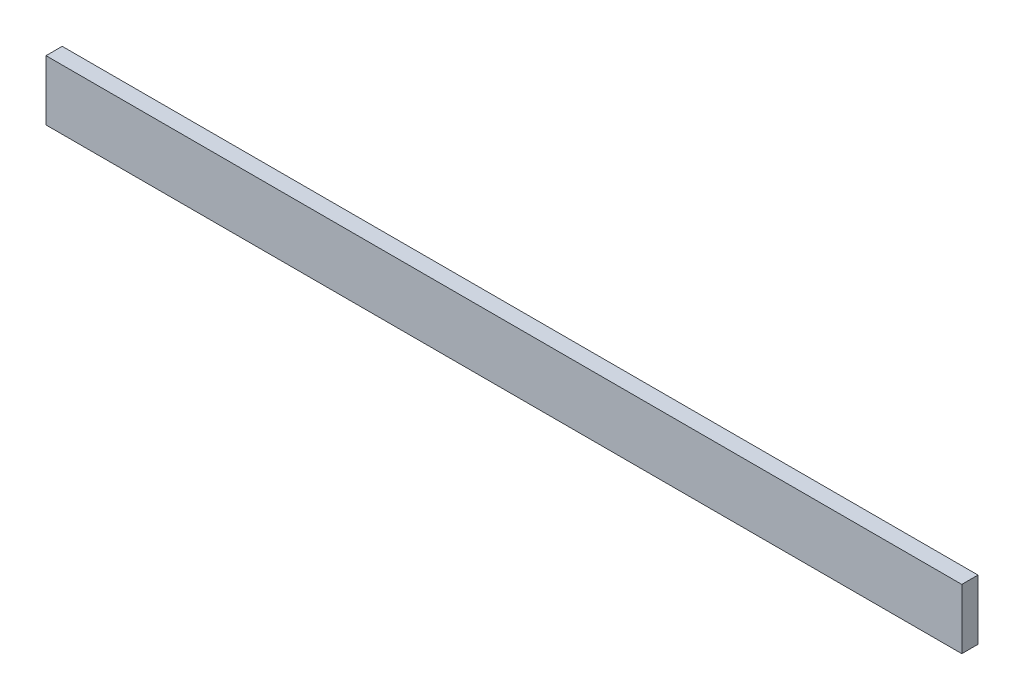
ISO-10303-21;
HEADER;
FILE_DESCRIPTION(('STEP AP214'),'2;1');
FILE_NAME('part.step','',(''),(''),'','','');
FILE_SCHEMA(('AUTOMOTIVE_DESIGN { 1 0 10303 214 1 1 1 1 }'));
ENDSEC;
DATA;
#1=APPLICATION_CONTEXT('core data for automotive mechanical design processes');
#2=APPLICATION_PROTOCOL_DEFINITION('international standard','automotive_design',2000,#1);
#3=PRODUCT_CONTEXT('',#1,'mechanical');
#4=PRODUCT('Part','Part','',(#3));
#5=PRODUCT_RELATED_PRODUCT_CATEGORY('part','',(#4));
#6=PRODUCT_DEFINITION_FORMATION('','',#4);
#7=PRODUCT_DEFINITION_CONTEXT('part definition',#1,'design');
#8=PRODUCT_DEFINITION('design','',#6,#7);
#9=PRODUCT_DEFINITION_SHAPE('','',#8);
#10=(LENGTH_UNIT() NAMED_UNIT(*) SI_UNIT(.MILLI.,.METRE.));
#11=(NAMED_UNIT(*) PLANE_ANGLE_UNIT() SI_UNIT($,.RADIAN.));
#12=(NAMED_UNIT(*) SI_UNIT($,.STERADIAN.) SOLID_ANGLE_UNIT());
#13=UNCERTAINTY_MEASURE_WITH_UNIT(LENGTH_MEASURE(1.E-05),#10,'distance_accuracy_value','');
#14=(GEOMETRIC_REPRESENTATION_CONTEXT(3) GLOBAL_UNCERTAINTY_ASSIGNED_CONTEXT((#13)) GLOBAL_UNIT_ASSIGNED_CONTEXT((#10,
#11,#12)) REPRESENTATION_CONTEXT('',''));
#15=CARTESIAN_POINT('',(0.,0.,0.));
#16=DIRECTION('',(0.,0.,1.));
#17=DIRECTION('',(1.,0.,0.));
#18=AXIS2_PLACEMENT_3D('',#15,#16,#17);
#19=CARTESIAN_POINT('',(0.,0.,27.));
#20=DIRECTION('',(1.,0.,0.));
#21=DIRECTION('',(0.,0.,-1.));
#22=AXIS2_PLACEMENT_3D('',#19,#20,#21);
#23=PLANE('',#22);
#24=DIRECTION('',(0.,-1.,0.));
#25=VECTOR('',#24,1.);
#26=CARTESIAN_POINT('',(0.,0.,0.));
#27=LINE('',#26,#25);
#28=CARTESIAN_POINT('',(0.,100.,0.));
#29=VERTEX_POINT('',#28);
#30=CARTESIAN_POINT('',(0.,0.,0.));
#31=VERTEX_POINT('',#30);
#32=EDGE_CURVE('E96',#29,#31,#27,.T.);
#33=ORIENTED_EDGE('',*,*,#32,.T.);
#34=DIRECTION('',(0.,0.,-1.));
#35=VECTOR('',#34,1.);
#36=CARTESIAN_POINT('',(0.,0.,27.));
#37=LINE('',#36,#35);
#38=CARTESIAN_POINT('',(0.,0.,27.));
#39=VERTEX_POINT('',#38);
#40=EDGE_CURVE('E11',#39,#31,#37,.T.);
#41=ORIENTED_EDGE('',*,*,#40,.F.);
#42=DIRECTION('',(0.,-1.,0.));
#43=VECTOR('',#42,1.);
#44=CARTESIAN_POINT('',(0.,0.,27.));
#45=LINE('',#44,#43);
#46=CARTESIAN_POINT('',(0.,100.,27.));
#47=VERTEX_POINT('',#46);
#48=EDGE_CURVE('E84',#47,#39,#45,.T.);
#49=ORIENTED_EDGE('',*,*,#48,.F.);
#50=DIRECTION('',(0.,0.,-1.));
#51=VECTOR('',#50,1.);
#52=CARTESIAN_POINT('',(0.,100.,27.));
#53=LINE('',#52,#51);
#54=EDGE_CURVE('E92',#47,#29,#53,.T.);
#55=ORIENTED_EDGE('',*,*,#54,.T.);
#56=EDGE_LOOP('',(#33,#41,#49,#55));
#57=FACE_BOUND('',#56,.T.);
#58=ADVANCED_FACE('F33',(#57),#23,.F.);
#59=CARTESIAN_POINT('',(0.,0.,27.));
#60=DIRECTION('',(0.,1.,0.));
#61=DIRECTION('',(0.,0.,1.));
#62=AXIS2_PLACEMENT_3D('',#59,#60,#61);
#63=PLANE('',#62);
#64=DIRECTION('',(1.,0.,0.));
#65=VECTOR('',#64,1.);
#66=CARTESIAN_POINT('',(0.,0.,0.));
#67=LINE('',#66,#65);
#68=CARTESIAN_POINT('',(1526.,0.,0.));
#69=VERTEX_POINT('',#68);
#70=EDGE_CURVE('E88',#31,#69,#67,.T.);
#71=ORIENTED_EDGE('',*,*,#70,.T.);
#72=DIRECTION('',(0.,0.,-1.));
#73=VECTOR('',#72,1.);
#74=CARTESIAN_POINT('',(1526.,0.,27.));
#75=LINE('',#74,#73);
#76=CARTESIAN_POINT('',(1526.,0.,27.));
#77=VERTEX_POINT('',#76);
#78=EDGE_CURVE('E41',#77,#69,#75,.T.);
#79=ORIENTED_EDGE('',*,*,#78,.F.);
#80=DIRECTION('',(1.,0.,0.));
#81=VECTOR('',#80,1.);
#82=CARTESIAN_POINT('',(0.,0.,27.));
#83=LINE('',#82,#81);
#84=EDGE_CURVE('E79',#39,#77,#83,.T.);
#85=ORIENTED_EDGE('',*,*,#84,.F.);
#86=ORIENTED_EDGE('',*,*,#40,.T.);
#87=EDGE_LOOP('',(#71,#79,#85,#86));
#88=FACE_BOUND('',#87,.T.);
#89=ADVANCED_FACE('F87',(#88),#63,.F.);
#90=CARTESIAN_POINT('',(1526.,0.,27.));
#91=DIRECTION('',(-1.,0.,0.));
#92=DIRECTION('',(0.,0.,1.));
#93=AXIS2_PLACEMENT_3D('',#90,#91,#92);
#94=PLANE('',#93);
#95=DIRECTION('',(0.,1.,0.));
#96=VECTOR('',#95,1.);
#97=CARTESIAN_POINT('',(1526.,0.,0.));
#98=LINE('',#97,#96);
#99=CARTESIAN_POINT('',(1526.,100.,0.));
#100=VERTEX_POINT('',#99);
#101=EDGE_CURVE('E66',#69,#100,#98,.T.);
#102=ORIENTED_EDGE('',*,*,#101,.T.);
#103=DIRECTION('',(0.,0.,-1.));
#104=VECTOR('',#103,1.);
#105=CARTESIAN_POINT('',(1526.,100.,27.));
#106=LINE('',#105,#104);
#107=CARTESIAN_POINT('',(1526.,100.,27.));
#108=VERTEX_POINT('',#107);
#109=EDGE_CURVE('E89',#108,#100,#106,.T.);
#110=ORIENTED_EDGE('',*,*,#109,.F.);
#111=DIRECTION('',(0.,1.,0.));
#112=VECTOR('',#111,1.);
#113=CARTESIAN_POINT('',(1526.,0.,27.));
#114=LINE('',#113,#112);
#115=EDGE_CURVE('E82',#77,#108,#114,.T.);
#116=ORIENTED_EDGE('',*,*,#115,.F.);
#117=ORIENTED_EDGE('',*,*,#78,.T.);
#118=EDGE_LOOP('',(#102,#110,#116,#117));
#119=FACE_BOUND('',#118,.T.);
#120=ADVANCED_FACE('F90',(#119),#94,.F.);
#121=CARTESIAN_POINT('',(0.,100.,27.));
#122=DIRECTION('',(0.,-1.,0.));
#123=DIRECTION('',(0.,0.,-1.));
#124=AXIS2_PLACEMENT_3D('',#121,#122,#123);
#125=PLANE('',#124);
#126=DIRECTION('',(-1.,0.,0.));
#127=VECTOR('',#126,1.);
#128=CARTESIAN_POINT('',(0.,100.,0.));
#129=LINE('',#128,#127);
#130=EDGE_CURVE('E72',#100,#29,#129,.T.);
#131=ORIENTED_EDGE('',*,*,#130,.T.);
#132=ORIENTED_EDGE('',*,*,#54,.F.);
#133=DIRECTION('',(-1.,0.,0.));
#134=VECTOR('',#133,1.);
#135=CARTESIAN_POINT('',(0.,100.,27.));
#136=LINE('',#135,#134);
#137=EDGE_CURVE('E49',#108,#47,#136,.T.);
#138=ORIENTED_EDGE('',*,*,#137,.F.);
#139=ORIENTED_EDGE('',*,*,#109,.T.);
#140=EDGE_LOOP('',(#131,#132,#138,#139));
#141=FACE_BOUND('',#140,.T.);
#142=ADVANCED_FACE('F103',(#141),#125,.F.);
#143=CARTESIAN_POINT('',(0.,0.,27.));
#144=DIRECTION('',(0.,0.,-1.));
#145=DIRECTION('',(-1.,0.,0.));
#146=AXIS2_PLACEMENT_3D('',#143,#144,#145);
#147=PLANE('',#146);
#148=ORIENTED_EDGE('',*,*,#48,.T.);
#149=ORIENTED_EDGE('',*,*,#84,.T.);
#150=ORIENTED_EDGE('',*,*,#115,.T.);
#151=ORIENTED_EDGE('',*,*,#137,.T.);
#152=EDGE_LOOP('',(#148,#149,#150,#151));
#153=FACE_BOUND('',#152,.T.);
#154=ADVANCED_FACE('F80',(#153),#147,.F.);
#155=CARTESIAN_POINT('',(0.,0.,0.));
#156=DIRECTION('',(0.,0.,-1.));
#157=DIRECTION('',(-1.,0.,0.));
#158=AXIS2_PLACEMENT_3D('',#155,#156,#157);
#159=PLANE('',#158);
#160=ORIENTED_EDGE('',*,*,#32,.F.);
#161=ORIENTED_EDGE('',*,*,#130,.F.);
#162=ORIENTED_EDGE('',*,*,#101,.F.);
#163=ORIENTED_EDGE('',*,*,#70,.F.);
#164=EDGE_LOOP('',(#160,#161,#162,#163));
#165=FACE_BOUND('',#164,.T.);
#166=ADVANCED_FACE('F106',(#165),#159,.T.);
#167=CLOSED_SHELL('',(#58,#89,#120,#142,#154,#166));
#168=MANIFOLD_SOLID_BREP('B2',#167);
#169=ADVANCED_BREP_SHAPE_REPRESENTATION('',(#18,#168),#14);
#170=SHAPE_DEFINITION_REPRESENTATION(#9,#169);
ENDSEC;
END-ISO-10303-21;
